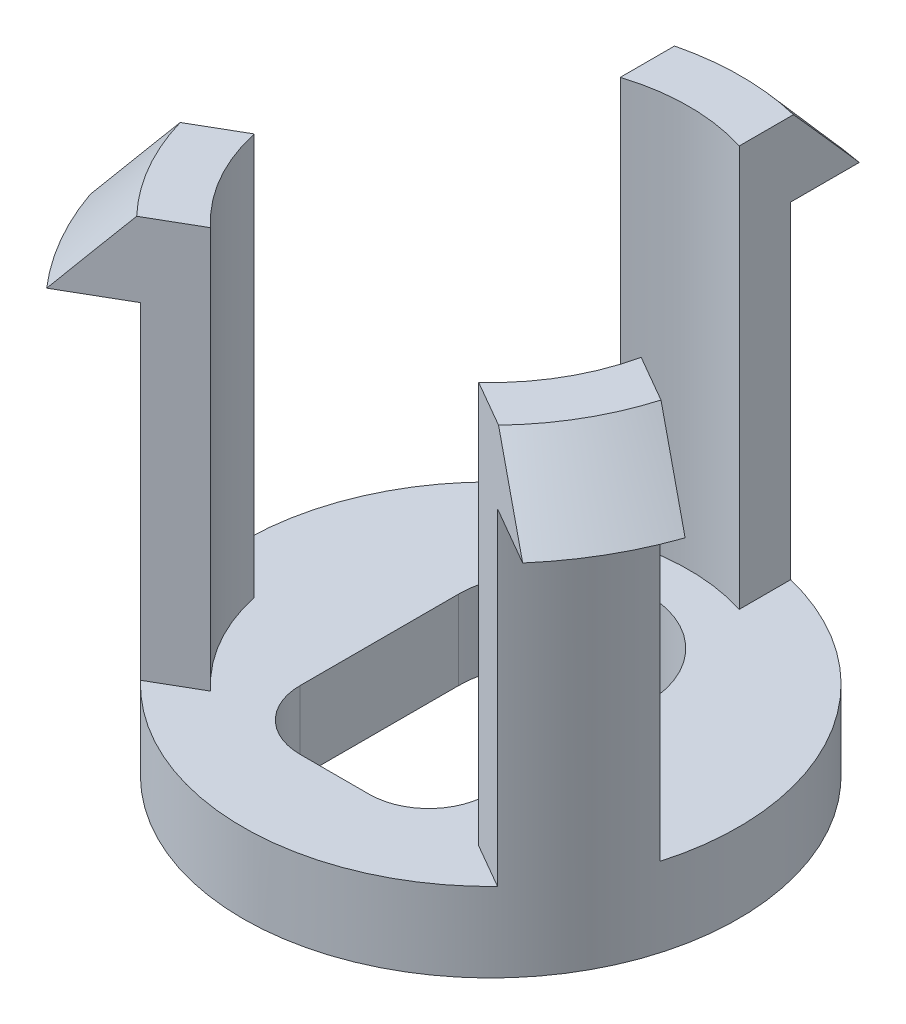
ISO-10303-21;
HEADER;
FILE_DESCRIPTION(('STEP AP214'),'2;1');
FILE_NAME('part.step','',(''),(''),'','','');
FILE_SCHEMA(('AUTOMOTIVE_DESIGN { 1 0 10303 214 1 1 1 1 }'));
ENDSEC;
DATA;
#1=APPLICATION_CONTEXT('core data for automotive mechanical design processes');
#2=APPLICATION_PROTOCOL_DEFINITION('international standard','automotive_design',2000,#1);
#3=PRODUCT_CONTEXT('',#1,'mechanical');
#4=PRODUCT('Part','Part','',(#3));
#5=PRODUCT_RELATED_PRODUCT_CATEGORY('part','',(#4));
#6=PRODUCT_DEFINITION_FORMATION('','',#4);
#7=PRODUCT_DEFINITION_CONTEXT('part definition',#1,'design');
#8=PRODUCT_DEFINITION('design','',#6,#7);
#9=PRODUCT_DEFINITION_SHAPE('','',#8);
#10=(LENGTH_UNIT() NAMED_UNIT(*) SI_UNIT(.MILLI.,.METRE.));
#11=(NAMED_UNIT(*) PLANE_ANGLE_UNIT() SI_UNIT($,.RADIAN.));
#12=(NAMED_UNIT(*) SI_UNIT($,.STERADIAN.) SOLID_ANGLE_UNIT());
#13=UNCERTAINTY_MEASURE_WITH_UNIT(LENGTH_MEASURE(1.E-05),#10,'distance_accuracy_value','');
#14=(GEOMETRIC_REPRESENTATION_CONTEXT(3) GLOBAL_UNCERTAINTY_ASSIGNED_CONTEXT((#13)) GLOBAL_UNIT_ASSIGNED_CONTEXT((#10,
#11,#12)) REPRESENTATION_CONTEXT('',''));
#15=CARTESIAN_POINT('',(0.,0.,0.));
#16=DIRECTION('',(0.,0.,1.));
#17=DIRECTION('',(1.,0.,0.));
#18=AXIS2_PLACEMENT_3D('',#15,#16,#17);
#19=CARTESIAN_POINT('',(0.,9.7,0.));
#20=DIRECTION('',(0.,1.,0.));
#21=DIRECTION('',(0.,0.,1.));
#22=AXIS2_PLACEMENT_3D('',#19,#20,#21);
#23=PLANE('',#22);
#24=DIRECTION('',(0.,0.,-1.));
#25=VECTOR('',#24,1.);
#26=CARTESIAN_POINT('',(1.2,9.7,-4.85386443980464));
#27=LINE('',#26,#25);
#28=CARTESIAN_POINT('',(1.2,9.7,-3.81575680566778));
#29=VERTEX_POINT('',#28);
#30=CARTESIAN_POINT('',(1.2,9.7,-4.90933251836967));
#31=VERTEX_POINT('',#30);
#32=EDGE_CURVE('E395',#29,#31,#27,.T.);
#33=ORIENTED_EDGE('',*,*,#32,.T.);
#34=CARTESIAN_POINT('',(0.,9.7,0.));
#35=DIRECTION('',(0.,-1.,0.));
#36=DIRECTION('',(0.,0.,-1.));
#37=AXIS2_PLACEMENT_3D('',#34,#35,#36);
#38=CIRCLE('',#37,5.05386443980464);
#39=CARTESIAN_POINT('',(-1.2,9.7,-4.90933251836967));
#40=VERTEX_POINT('',#39);
#41=EDGE_CURVE('E320',#40,#31,#38,.T.);
#42=ORIENTED_EDGE('',*,*,#41,.F.);
#43=DIRECTION('',(0.,0.,1.));
#44=VECTOR('',#43,1.);
#45=CARTESIAN_POINT('',(-1.2,9.7,-4.85386443980464));
#46=LINE('',#45,#44);
#47=CARTESIAN_POINT('',(-1.2,9.7,-3.81575680566778));
#48=VERTEX_POINT('',#47);
#49=EDGE_CURVE('E390',#40,#48,#46,.T.);
#50=ORIENTED_EDGE('',*,*,#49,.T.);
#51=CARTESIAN_POINT('',(0.,9.7,0.));
#52=DIRECTION('',(0.,-1.,0.));
#53=DIRECTION('',(0.,0.,1.));
#54=AXIS2_PLACEMENT_3D('',#51,#52,#53);
#55=CIRCLE('',#54,4.);
#56=EDGE_CURVE('E392',#48,#29,#55,.T.);
#57=ORIENTED_EDGE('',*,*,#56,.T.);
#58=EDGE_LOOP('',(#33,#42,#50,#57));
#59=FACE_BOUND('',#58,.T.);
#60=ADVANCED_FACE('F30',(#59),#23,.T.);
#61=CARTESIAN_POINT('',(0.,8.2,-6.35386443980464));
#62=DIRECTION('',(0.,-1.,0.));
#63=DIRECTION('',(0.,0.,-1.));
#64=AXIS2_PLACEMENT_3D('',#61,#62,#63);
#65=PLANE('',#64);
#66=DIRECTION('',(0.,0.,-1.));
#67=VECTOR('',#66,1.);
#68=CARTESIAN_POINT('',(1.2,8.2,-6.2395186769024));
#69=LINE('',#68,#67);
#70=CARTESIAN_POINT('',(1.2,8.2,-4.85386443980464));
#71=VERTEX_POINT('',#70);
#72=CARTESIAN_POINT('',(1.2,8.2,-6.2395186769024));
#73=VERTEX_POINT('',#72);
#74=EDGE_CURVE('E227',#71,#73,#69,.T.);
#75=ORIENTED_EDGE('',*,*,#74,.F.);
#76=CARTESIAN_POINT('',(0.,8.2,0.));
#77=DIRECTION('',(0.,-1.,0.));
#78=DIRECTION('',(0.,0.,-1.));
#79=AXIS2_PLACEMENT_3D('',#76,#77,#78);
#80=CIRCLE('',#79,5.);
#81=CARTESIAN_POINT('',(-1.2,8.2,-4.85386443980464));
#82=VERTEX_POINT('',#81);
#83=EDGE_CURVE('E341',#82,#71,#80,.T.);
#84=ORIENTED_EDGE('',*,*,#83,.F.);
#85=DIRECTION('',(0.,0.,1.));
#86=VECTOR('',#85,1.);
#87=CARTESIAN_POINT('',(-1.2,8.2,-4.85386443980464));
#88=LINE('',#87,#86);
#89=CARTESIAN_POINT('',(-1.2,8.2,-6.2395186769024));
#90=VERTEX_POINT('',#89);
#91=EDGE_CURVE('E464',#90,#82,#88,.T.);
#92=ORIENTED_EDGE('',*,*,#91,.F.);
#93=CARTESIAN_POINT('',(0.,8.2,0.));
#94=DIRECTION('',(0.,-1.,0.));
#95=DIRECTION('',(0.,0.,-1.));
#96=AXIS2_PLACEMENT_3D('',#93,#94,#95);
#97=CIRCLE('',#96,6.35386443980464);
#98=EDGE_CURVE('E333',#90,#73,#97,.T.);
#99=ORIENTED_EDGE('',*,*,#98,.T.);
#100=EDGE_LOOP('',(#75,#84,#92,#99));
#101=FACE_BOUND('',#100,.T.);
#102=ADVANCED_FACE('F293',(#101),#65,.T.);
#103=CARTESIAN_POINT('',(0.,8.2,0.));
#104=DIRECTION('',(0.,-1.,0.));
#105=DIRECTION('',(0.,0.,-1.));
#106=AXIS2_PLACEMENT_3D('',#103,#104,#105);
#107=CONICAL_SURFACE('',#106,6.35386443980464,0.714090698612158);
#108=CARTESIAN_POINT('',(1.2,5.58286886134033,-8.53812952835899));
#109=CARTESIAN_POINT('',(1.2,5.81730456258432,-8.33295397783278));
#110=CARTESIAN_POINT('',(1.2,6.05167091913458,-8.12769928122429));
#111=CARTESIAN_POINT('',(1.2,6.52022532734995,-7.71698587480679));
#112=CARTESIAN_POINT('',(1.2,6.75441337878423,-7.51152716473445));
#113=CARTESIAN_POINT('',(1.2,7.45663956588861,-6.89478616674094));
#114=CARTESIAN_POINT('',(1.2,7.92434993069708,-6.48313009431151));
#115=CARTESIAN_POINT('',(1.2,8.62477351205438,-5.8643411975775));
#116=CARTESIAN_POINT('',(1.2,8.85806062443457,-5.65785817460679));
#117=CARTESIAN_POINT('',(1.2,9.32409883499572,-5.24428960419535));
#118=CARTESIAN_POINT('',(1.2,9.55684993517134,-5.0372040590033));
#119=CARTESIAN_POINT('',(1.2,10.0215991079049,-4.62217806334628));
#120=CARTESIAN_POINT('',(1.2,10.2535971634296,-4.41423759378138));
#121=CARTESIAN_POINT('',(1.2,10.6007380196826,-4.10137358004929));
#122=CARTESIAN_POINT('',(1.2,10.7163096492232,-3.99692603876367));
#123=CARTESIAN_POINT('',(1.2,10.9470865383504,-3.78762612077505));
#124=CARTESIAN_POINT('',(1.2,11.0622917963956,-3.68277374237276));
#125=CARTESIAN_POINT('',(1.2,11.1772731452379,-3.57767563893612));
#126=B_SPLINE_CURVE_WITH_KNOTS('',3,(#108,#109,#110,#111,#112,#113,#114,#115,#116,#117,#118,
#119,#120,#121,#122,#123,#124,#125),.UNSPECIFIED.,.F.,.F.,(4,2,2,2,2,2,2,2,4),(0.,
0.934619516385951,1.86924024070846,3.73844105368542,4.67306485780881,5.60768517827459,
6.54232649386947,7.00965295795956,7.47698138579348),.UNSPECIFIED.);
#127=EDGE_CURVE('E236',#73,#31,#126,.T.);
#128=ORIENTED_EDGE('',*,*,#127,.F.);
#129=ORIENTED_EDGE('',*,*,#98,.F.);
#130=CARTESIAN_POINT('',(-1.2,11.1772731452379,-3.57767563893612));
#131=CARTESIAN_POINT('',(-1.2,11.0622917963956,-3.68277374237276));
#132=CARTESIAN_POINT('',(-1.2,10.9470865383504,-3.78762612077506));
#133=CARTESIAN_POINT('',(-1.2,10.7163096492232,-3.99692603876367));
#134=CARTESIAN_POINT('',(-1.2,10.6007380196826,-4.10137358004929));
#135=CARTESIAN_POINT('',(-1.2,10.2535971634296,-4.41423759378138));
#136=CARTESIAN_POINT('',(-1.2,10.0215991079049,-4.62217806334628));
#137=CARTESIAN_POINT('',(-1.2,9.55684993517134,-5.0372040590033));
#138=CARTESIAN_POINT('',(-1.2,9.32409883499572,-5.24428960419535));
#139=CARTESIAN_POINT('',(-1.2,8.85806062443457,-5.65785817460679));
#140=CARTESIAN_POINT('',(-1.2,8.62477351205438,-5.8643411975775));
#141=CARTESIAN_POINT('',(-1.2,7.92434993069708,-6.48313009431151));
#142=CARTESIAN_POINT('',(-1.2,7.45663956588861,-6.89478616674094));
#143=CARTESIAN_POINT('',(-1.2,6.75441337878423,-7.51152716473445));
#144=CARTESIAN_POINT('',(-1.2,6.52022532734996,-7.71698587480679));
#145=CARTESIAN_POINT('',(-1.2,6.05167091913458,-8.12769928122429));
#146=CARTESIAN_POINT('',(-1.2,5.81730456258432,-8.33295397783278));
#147=CARTESIAN_POINT('',(-1.2,5.58286886134034,-8.53812952835898));
#148=B_SPLINE_CURVE_WITH_KNOTS('',3,(#130,#131,#132,#133,#134,#135,#136,#137,#138,#139,#140,
#141,#142,#143,#144,#145,#146,#147),.UNSPECIFIED.,.F.,.F.,(4,2,2,2,2,2,2,2,4),(0.,
0.467328427833928,0.934654891924016,1.86929620751889,2.80391652798467,3.73854033210806,
5.60774114508503,6.54236186940753,7.47698138579348),.UNSPECIFIED.);
#149=EDGE_CURVE('E474',#40,#90,#148,.T.);
#150=ORIENTED_EDGE('',*,*,#149,.F.);
#151=ORIENTED_EDGE('',*,*,#41,.T.);
#152=EDGE_LOOP('',(#128,#129,#150,#151));
#153=FACE_BOUND('',#152,.T.);
#154=ADVANCED_FACE('F298',(#153),#107,.T.);
#155=CARTESIAN_POINT('',(4.85160667653316,9.7,1.41543577464353));
#156=VERTEX_POINT('',#155);
#157=CARTESIAN_POINT('',(3.65160667653315,9.7,3.49389674372618));
#158=VERTEX_POINT('',#157);
#159=EDGE_CURVE('E311',#156,#158,#38,.T.);
#160=ORIENTED_EDGE('',*,*,#159,.F.);
#161=DIRECTION('',(-0.866025403784437,0.,-0.500000000000004));
#162=VECTOR('',#161,1.);
#163=CARTESIAN_POINT('',(4.80356991139674,9.7,1.38770173536102));
#164=LINE('',#163,#162);
#165=CARTESIAN_POINT('',(3.90454232837166,9.7,0.868647918292585));
#166=VERTEX_POINT('',#165);
#167=EDGE_CURVE('E312',#156,#166,#164,.T.);
#168=ORIENTED_EDGE('',*,*,#167,.T.);
#169=CARTESIAN_POINT('',(0.,9.7,0.));
#170=DIRECTION('',(0.,-1.,0.));
#171=DIRECTION('',(-0.866025403784436,0.,-0.500000000000004));
#172=AXIS2_PLACEMENT_3D('',#169,#170,#171);
#173=CIRCLE('',#172,4.);
#174=CARTESIAN_POINT('',(2.70454232837165,9.7,2.94710888737523));
#175=VERTEX_POINT('',#174);
#176=EDGE_CURVE('E370',#166,#175,#173,.T.);
#177=ORIENTED_EDGE('',*,*,#176,.T.);
#178=DIRECTION('',(0.866025403784437,0.,0.500000000000004));
#179=VECTOR('',#178,1.);
#180=CARTESIAN_POINT('',(3.60356991139673,9.7,3.46616270444366));
#181=LINE('',#180,#179);
#182=EDGE_CURVE('E315',#175,#158,#181,.T.);
#183=ORIENTED_EDGE('',*,*,#182,.T.);
#184=EDGE_LOOP('',(#160,#168,#177,#183));
#185=FACE_BOUND('',#184,.T.);
#186=ADVANCED_FACE('F261',(#185),#23,.T.);
#187=DIRECTION('',(-0.866025403784437,0.,-0.500000000000002));
#188=VECTOR('',#187,1.);
#189=CARTESIAN_POINT('',(4.80356991139674,8.2,1.38770173536102));
#190=LINE('',#189,#188);
#191=CARTESIAN_POINT('',(6.00358168158494,8.2,2.0805288539099));
#192=VERTEX_POINT('',#191);
#193=CARTESIAN_POINT('',(4.80356991139674,8.2,1.38770173536102));
#194=VERTEX_POINT('',#193);
#195=EDGE_CURVE('E224',#192,#194,#190,.T.);
#196=ORIENTED_EDGE('',*,*,#195,.F.);
#197=CARTESIAN_POINT('',(4.80358168158493,8.2,4.15898982299255));
#198=VERTEX_POINT('',#197);
#199=EDGE_CURVE('E337',#192,#198,#97,.T.);
#200=ORIENTED_EDGE('',*,*,#199,.T.);
#201=DIRECTION('',(0.866025403784436,0.,0.500000000000004));
#202=VECTOR('',#201,1.);
#203=CARTESIAN_POINT('',(4.80358168158493,8.2,4.15898982299255));
#204=LINE('',#203,#202);
#205=CARTESIAN_POINT('',(3.60356991139673,8.2,3.46616270444366));
#206=VERTEX_POINT('',#205);
#207=EDGE_CURVE('E535',#206,#198,#204,.T.);
#208=ORIENTED_EDGE('',*,*,#207,.F.);
#209=EDGE_CURVE('E340',#194,#206,#80,.T.);
#210=ORIENTED_EDGE('',*,*,#209,.F.);
#211=EDGE_LOOP('',(#196,#200,#208,#210));
#212=FACE_BOUND('',#211,.T.);
#213=ADVANCED_FACE('F300',(#212),#65,.T.);
#214=CARTESIAN_POINT('',(4.8514521459991,9.7002,1.41534655639809));
#215=CARTESIAN_POINT('',(4.9478001074423,9.57549928343645,1.4709730778732));
#216=CARTESIAN_POINT('',(5.04404801685495,9.45069560449613,1.52654183428153));
#217=CARTESIAN_POINT('',(5.23637311640144,9.20091336298655,1.63758078227662));
#218=CARTESIAN_POINT('',(5.33245030683866,9.07593480072876,1.69305097403853));
#219=CARTESIAN_POINT('',(5.52446364224954,8.82583345957066,1.803909924926));
#220=CARTESIAN_POINT('',(5.6203997873018,8.70071068075078,1.85929868409694));
#221=CARTESIAN_POINT('',(5.81215204008776,8.45034214061854,1.97000689886063));
#222=CARTESIAN_POINT('',(5.90796814760827,8.32509637908849,2.0253263543303));
#223=CARTESIAN_POINT('',(6.00373454352155,8.1998,2.08061710879015));
#224=B_SPLINE_CURVE_WITH_KNOTS('',3,(#214,#215,#216,#217,#218,#219,#220,#221,#222,#223),
.UNSPECIFIED.,.F.,.F.,(4,2,2,2,4),(0.,0.501345575027477,1.00269025829784,1.50403466213868,
2.00537995507539),.UNSPECIFIED.);
#225=EDGE_CURVE('E229',#156,#192,#224,.T.);
#226=ORIENTED_EDGE('',*,*,#225,.F.);
#227=ORIENTED_EDGE('',*,*,#159,.T.);
#228=CARTESIAN_POINT('',(4.80373454352154,8.1998,4.1590780778728));
#229=CARTESIAN_POINT('',(4.70796814760826,8.32509637908849,4.10378732341295));
#230=CARTESIAN_POINT('',(4.61215204008775,8.45034214061855,4.04846786794327));
#231=CARTESIAN_POINT('',(4.42039978730179,8.70071068075078,3.93775965317959));
#232=CARTESIAN_POINT('',(4.32446364224953,8.82583345957066,3.88237089400865));
#233=CARTESIAN_POINT('',(4.13245030683865,9.07593480072876,3.77151194312117));
#234=CARTESIAN_POINT('',(4.03637311640144,9.20091336298655,3.71604175135927));
#235=CARTESIAN_POINT('',(3.84404801685494,9.45069560449613,3.60500280336417));
#236=CARTESIAN_POINT('',(3.74780010744229,9.57549928343645,3.54943404695584));
#237=CARTESIAN_POINT('',(3.65145214599909,9.7002,3.49380752548074));
#238=B_SPLINE_CURVE_WITH_KNOTS('',3,(#228,#229,#230,#231,#232,#233,#234,#235,#236,#237),
.UNSPECIFIED.,.F.,.F.,(4,2,2,2,4),(0.,0.501345292936719,1.00268969677755,1.50403438004792,
2.00537995507539),.UNSPECIFIED.);
#239=EDGE_CURVE('E458',#198,#158,#238,.T.);
#240=ORIENTED_EDGE('',*,*,#239,.F.);
#241=ORIENTED_EDGE('',*,*,#199,.F.);
#242=EDGE_LOOP('',(#226,#227,#240,#241));
#243=FACE_BOUND('',#242,.T.);
#244=ADVANCED_FACE('F259',(#243),#107,.T.);
#245=CARTESIAN_POINT('',(-3.6516066765332,9.7,3.49389674372613));
#246=VERTEX_POINT('',#245);
#247=CARTESIAN_POINT('',(-4.85160667653318,9.7,1.41543577464346));
#248=VERTEX_POINT('',#247);
#249=EDGE_CURVE('E321',#246,#248,#38,.T.);
#250=ORIENTED_EDGE('',*,*,#249,.F.);
#251=DIRECTION('',(0.866025403784443,0.,-0.499999999999992));
#252=VECTOR('',#251,1.);
#253=CARTESIAN_POINT('',(-3.60356991139677,9.7,3.46616270444361));
#254=LINE('',#253,#252);
#255=CARTESIAN_POINT('',(-2.70454232837169,9.7,2.94710888737519));
#256=VERTEX_POINT('',#255);
#257=EDGE_CURVE('E342',#246,#256,#254,.T.);
#258=ORIENTED_EDGE('',*,*,#257,.T.);
#259=CARTESIAN_POINT('',(0.,9.7,0.));
#260=DIRECTION('',(0.,-1.,0.));
#261=DIRECTION('',(0.866025403784443,0.,-0.499999999999992));
#262=AXIS2_PLACEMENT_3D('',#259,#260,#261);
#263=CIRCLE('',#262,4.);
#264=CARTESIAN_POINT('',(-3.90454232837167,9.7,0.868647918292529));
#265=VERTEX_POINT('',#264);
#266=EDGE_CURVE('E344',#256,#265,#263,.T.);
#267=ORIENTED_EDGE('',*,*,#266,.T.);
#268=DIRECTION('',(-0.866025403784443,0.,0.499999999999992));
#269=VECTOR('',#268,1.);
#270=CARTESIAN_POINT('',(-4.80356991139675,9.7,1.38770173536095));
#271=LINE('',#270,#269);
#272=EDGE_CURVE('E347',#265,#248,#271,.T.);
#273=ORIENTED_EDGE('',*,*,#272,.T.);
#274=EDGE_LOOP('',(#250,#258,#267,#273));
#275=FACE_BOUND('',#274,.T.);
#276=ADVANCED_FACE('F255',(#275),#23,.T.);
#277=DIRECTION('',(0.866025403784443,0.,-0.499999999999992));
#278=VECTOR('',#277,1.);
#279=CARTESIAN_POINT('',(-3.60356991139677,8.2,3.46616270444361));
#280=LINE('',#279,#278);
#281=CARTESIAN_POINT('',(-4.80358168158499,8.2,4.15898982299248));
#282=VERTEX_POINT('',#281);
#283=CARTESIAN_POINT('',(-3.60356991139677,8.2,3.46616270444361));
#284=VERTEX_POINT('',#283);
#285=EDGE_CURVE('E537',#282,#284,#280,.T.);
#286=ORIENTED_EDGE('',*,*,#285,.F.);
#287=CARTESIAN_POINT('',(-6.00358168158497,8.2,2.08052885390982));
#288=VERTEX_POINT('',#287);
#289=EDGE_CURVE('E324',#282,#288,#97,.T.);
#290=ORIENTED_EDGE('',*,*,#289,.T.);
#291=DIRECTION('',(-0.866025403784443,0.,0.499999999999993));
#292=VECTOR('',#291,1.);
#293=CARTESIAN_POINT('',(-6.00358168158497,8.2,2.08052885390982));
#294=LINE('',#293,#292);
#295=CARTESIAN_POINT('',(-4.80356991139675,8.2,1.38770173536095));
#296=VERTEX_POINT('',#295);
#297=EDGE_CURVE('E472',#296,#288,#294,.T.);
#298=ORIENTED_EDGE('',*,*,#297,.F.);
#299=EDGE_CURVE('E336',#284,#296,#80,.T.);
#300=ORIENTED_EDGE('',*,*,#299,.F.);
#301=EDGE_LOOP('',(#286,#290,#298,#300));
#302=FACE_BOUND('',#301,.T.);
#303=ADVANCED_FACE('F258',(#302),#65,.T.);
#304=CARTESIAN_POINT('',(0.,1.6,0.));
#305=DIRECTION('',(0.,1.,0.));
#306=DIRECTION('',(0.,0.,1.));
#307=AXIS2_PLACEMENT_3D('',#304,#305,#306);
#308=PLANE('',#307);
#309=CARTESIAN_POINT('',(0.,1.6,-1.25));
#310=DIRECTION('',(0.,1.,0.));
#311=DIRECTION('',(0.,0.,-1.));
#312=AXIS2_PLACEMENT_3D('',#309,#310,#311);
#313=CIRCLE('',#312,1.9);
#314=CARTESIAN_POINT('',(1.9,1.6,-1.25));
#315=VERTEX_POINT('',#314);
#316=CARTESIAN_POINT('',(-1.9,1.6,-1.25));
#317=VERTEX_POINT('',#316);
#318=EDGE_CURVE('E197',#315,#317,#313,.T.);
#319=ORIENTED_EDGE('',*,*,#318,.F.);
#320=DIRECTION('',(0.,0.,-1.));
#321=VECTOR('',#320,1.);
#322=CARTESIAN_POINT('',(1.9,1.6,3.15));
#323=LINE('',#322,#321);
#324=CARTESIAN_POINT('',(1.9,1.6,1.95));
#325=VERTEX_POINT('',#324);
#326=EDGE_CURVE('E212',#325,#315,#323,.T.);
#327=ORIENTED_EDGE('',*,*,#326,.F.);
#328=CARTESIAN_POINT('',(0.699999999999999,1.6,1.95));
#329=DIRECTION('',(0.,1.,0.));
#330=DIRECTION('',(0.,0.,1.));
#331=AXIS2_PLACEMENT_3D('',#328,#329,#330);
#332=CIRCLE('',#331,1.2);
#333=CARTESIAN_POINT('',(0.699999999999999,1.6,3.15));
#334=VERTEX_POINT('',#333);
#335=EDGE_CURVE('E433',#325,#334,#332,.F.);
#336=ORIENTED_EDGE('',*,*,#335,.T.);
#337=DIRECTION('',(1.,0.,0.));
#338=VECTOR('',#337,1.);
#339=CARTESIAN_POINT('',(-1.9,1.6,3.15));
#340=LINE('',#339,#338);
#341=CARTESIAN_POINT('',(-0.700000000000001,1.6,3.15));
#342=VERTEX_POINT('',#341);
#343=EDGE_CURVE('E214',#342,#334,#340,.T.);
#344=ORIENTED_EDGE('',*,*,#343,.F.);
#345=CARTESIAN_POINT('',(-0.700000000000001,1.6,1.95));
#346=DIRECTION('',(0.,1.,0.));
#347=DIRECTION('',(0.,0.,1.));
#348=AXIS2_PLACEMENT_3D('',#345,#346,#347);
#349=CIRCLE('',#348,1.2);
#350=CARTESIAN_POINT('',(-1.9,1.6,1.95));
#351=VERTEX_POINT('',#350);
#352=EDGE_CURVE('E38',#342,#351,#349,.F.);
#353=ORIENTED_EDGE('',*,*,#352,.T.);
#354=DIRECTION('',(0.,0.,1.));
#355=VECTOR('',#354,1.);
#356=CARTESIAN_POINT('',(-1.9,1.6,3.15));
#357=LINE('',#356,#355);
#358=EDGE_CURVE('E220',#317,#351,#357,.T.);
#359=ORIENTED_EDGE('',*,*,#358,.F.);
#360=EDGE_LOOP('',(#319,#327,#336,#344,#353,#359));
#361=FACE_BOUND('',#360,.T.);
#362=CARTESIAN_POINT('',(0.,1.6,0.));
#363=DIRECTION('',(0.,-1.,0.));
#364=DIRECTION('',(0.866025403784443,0.,-0.499999999999992));
#365=AXIS2_PLACEMENT_3D('',#362,#363,#364);
#366=CIRCLE('',#365,4.);
#367=CARTESIAN_POINT('',(-2.70454232837169,1.6,2.94710888737519));
#368=VERTEX_POINT('',#367);
#369=CARTESIAN_POINT('',(-3.90454232837167,1.6,0.86864791829253));
#370=VERTEX_POINT('',#369);
#371=EDGE_CURVE('E354',#368,#370,#366,.T.);
#372=ORIENTED_EDGE('',*,*,#371,.F.);
#373=DIRECTION('',(0.866025403784443,0.,-0.499999999999992));
#374=VECTOR('',#373,1.);
#375=CARTESIAN_POINT('',(-3.60356991139677,1.6,3.46616270444361));
#376=LINE('',#375,#374);
#377=CARTESIAN_POINT('',(-3.60356991139677,1.6,3.46616270444361));
#378=VERTEX_POINT('',#377);
#379=EDGE_CURVE('E351',#378,#368,#376,.T.);
#380=ORIENTED_EDGE('',*,*,#379,.F.);
#381=CARTESIAN_POINT('',(0.,1.6,0.));
#382=DIRECTION('',(0.,1.,0.));
#383=DIRECTION('',(0.,0.,1.));
#384=AXIS2_PLACEMENT_3D('',#381,#382,#383);
#385=CIRCLE('',#384,5.);
#386=CARTESIAN_POINT('',(3.60356991139673,1.6,3.46616270444366));
#387=VERTEX_POINT('',#386);
#388=EDGE_CURVE('E418',#378,#387,#385,.T.);
#389=ORIENTED_EDGE('',*,*,#388,.T.);
#390=DIRECTION('',(0.866025403784437,0.,0.500000000000004));
#391=VECTOR('',#390,1.);
#392=CARTESIAN_POINT('',(3.60356991139673,1.6,3.46616270444366));
#393=LINE('',#392,#391);
#394=CARTESIAN_POINT('',(2.70454232837165,1.6,2.94710888737523));
#395=VERTEX_POINT('',#394);
#396=EDGE_CURVE('E371',#395,#387,#393,.T.);
#397=ORIENTED_EDGE('',*,*,#396,.F.);
#398=CARTESIAN_POINT('',(0.,1.6,0.));
#399=DIRECTION('',(0.,-1.,0.));
#400=DIRECTION('',(-0.866025403784436,0.,-0.500000000000004));
#401=AXIS2_PLACEMENT_3D('',#398,#399,#400);
#402=CIRCLE('',#401,4.);
#403=CARTESIAN_POINT('',(3.90454232837166,1.6,0.868647918292585));
#404=VERTEX_POINT('',#403);
#405=EDGE_CURVE('E376',#404,#395,#402,.T.);
#406=ORIENTED_EDGE('',*,*,#405,.F.);
#407=DIRECTION('',(-0.866025403784437,0.,-0.500000000000004));
#408=VECTOR('',#407,1.);
#409=CARTESIAN_POINT('',(4.80356991139674,1.6,1.38770173536102));
#410=LINE('',#409,#408);
#411=CARTESIAN_POINT('',(4.80356991139674,1.6,1.38770173536102));
#412=VERTEX_POINT('',#411);
#413=EDGE_CURVE('E368',#412,#404,#410,.T.);
#414=ORIENTED_EDGE('',*,*,#413,.F.);
#415=CARTESIAN_POINT('',(1.2,1.6,-4.85386443980464));
#416=VERTEX_POINT('',#415);
#417=EDGE_CURVE('E413',#412,#416,#385,.T.);
#418=ORIENTED_EDGE('',*,*,#417,.T.);
#419=DIRECTION('',(0.,0.,-1.));
#420=VECTOR('',#419,1.);
#421=CARTESIAN_POINT('',(1.2,1.6,-4.85386443980464));
#422=LINE('',#421,#420);
#423=CARTESIAN_POINT('',(1.2,1.6,-3.81575680566778));
#424=VERTEX_POINT('',#423);
#425=EDGE_CURVE('E393',#424,#416,#422,.T.);
#426=ORIENTED_EDGE('',*,*,#425,.F.);
#427=CARTESIAN_POINT('',(0.,1.6,0.));
#428=DIRECTION('',(0.,-1.,0.));
#429=DIRECTION('',(0.,0.,1.));
#430=AXIS2_PLACEMENT_3D('',#427,#428,#429);
#431=CIRCLE('',#430,4.);
#432=CARTESIAN_POINT('',(-1.2,1.6,-3.81575680566778));
#433=VERTEX_POINT('',#432);
#434=EDGE_CURVE('E398',#433,#424,#431,.T.);
#435=ORIENTED_EDGE('',*,*,#434,.F.);
#436=DIRECTION('',(0.,0.,1.));
#437=VECTOR('',#436,1.);
#438=CARTESIAN_POINT('',(-1.2,1.6,-4.85386443980464));
#439=LINE('',#438,#437);
#440=CARTESIAN_POINT('',(-1.2,1.6,-4.85386443980464));
#441=VERTEX_POINT('',#440);
#442=EDGE_CURVE('E389',#441,#433,#439,.T.);
#443=ORIENTED_EDGE('',*,*,#442,.F.);
#444=CARTESIAN_POINT('',(-4.80356991139675,1.6,1.38770173536095));
#445=VERTEX_POINT('',#444);
#446=EDGE_CURVE('E427',#441,#445,#385,.T.);
#447=ORIENTED_EDGE('',*,*,#446,.T.);
#448=DIRECTION('',(-0.866025403784443,0.,0.499999999999992));
#449=VECTOR('',#448,1.);
#450=CARTESIAN_POINT('',(-4.80356991139675,1.6,1.38770173536095));
#451=LINE('',#450,#449);
#452=EDGE_CURVE('E345',#370,#445,#451,.T.);
#453=ORIENTED_EDGE('',*,*,#452,.F.);
#454=EDGE_LOOP('',(#372,#380,#389,#397,#406,#414,#418,#426,#435,#443,#447,#453));
#455=FACE_BOUND('',#454,.T.);
#456=ADVANCED_FACE('F273',(#361,#455),#308,.T.);
#457=CARTESIAN_POINT('',(0.,1.6,0.));
#458=DIRECTION('',(0.,-1.,0.));
#459=DIRECTION('',(0.,0.,-1.));
#460=AXIS2_PLACEMENT_3D('',#457,#458,#459);
#461=CYLINDRICAL_SURFACE('',#460,5.);
#462=DIRECTION('',(0.,-1.,0.));
#463=VECTOR('',#462,1.);
#464=CARTESIAN_POINT('',(4.80356991139674,9.7,1.38770173536102));
#465=LINE('',#464,#463);
#466=EDGE_CURVE('E387',#194,#412,#465,.T.);
#467=ORIENTED_EDGE('',*,*,#466,.F.);
#468=ORIENTED_EDGE('',*,*,#209,.T.);
#469=DIRECTION('',(0.,-1.,0.));
#470=VECTOR('',#469,1.);
#471=CARTESIAN_POINT('',(3.60356991139673,9.7,3.46616270444366));
#472=LINE('',#471,#470);
#473=EDGE_CURVE('E374',#206,#387,#472,.T.);
#474=ORIENTED_EDGE('',*,*,#473,.T.);
#475=ORIENTED_EDGE('',*,*,#388,.F.);
#476=DIRECTION('',(0.,-1.,0.));
#477=VECTOR('',#476,1.);
#478=CARTESIAN_POINT('',(-3.60356991139677,9.7,3.46616270444361));
#479=LINE('',#478,#477);
#480=EDGE_CURVE('E366',#284,#378,#479,.T.);
#481=ORIENTED_EDGE('',*,*,#480,.F.);
#482=ORIENTED_EDGE('',*,*,#299,.T.);
#483=DIRECTION('',(0.,-1.,0.));
#484=VECTOR('',#483,1.);
#485=CARTESIAN_POINT('',(-4.80356991139675,9.7,1.38770173536095));
#486=LINE('',#485,#484);
#487=EDGE_CURVE('E350',#296,#445,#486,.T.);
#488=ORIENTED_EDGE('',*,*,#487,.T.);
#489=ORIENTED_EDGE('',*,*,#446,.F.);
#490=DIRECTION('',(0.,-1.,0.));
#491=VECTOR('',#490,1.);
#492=CARTESIAN_POINT('',(-1.2,9.7,-4.85386443980464));
#493=LINE('',#492,#491);
#494=EDGE_CURVE('E419',#82,#441,#493,.T.);
#495=ORIENTED_EDGE('',*,*,#494,.F.);
#496=ORIENTED_EDGE('',*,*,#83,.T.);
#497=DIRECTION('',(0.,-1.,0.));
#498=VECTOR('',#497,1.);
#499=CARTESIAN_POINT('',(1.2,9.7,-4.85386443980464));
#500=LINE('',#499,#498);
#501=EDGE_CURVE('E397',#71,#416,#500,.T.);
#502=ORIENTED_EDGE('',*,*,#501,.T.);
#503=ORIENTED_EDGE('',*,*,#417,.F.);
#504=EDGE_LOOP('',(#467,#468,#474,#475,#481,#482,#488,#489,#495,#496,#502,#503));
#505=FACE_BOUND('',#504,.T.);
#506=CARTESIAN_POINT('',(0.,0.,0.));
#507=DIRECTION('',(0.,1.,0.));
#508=DIRECTION('',(0.,0.,1.));
#509=AXIS2_PLACEMENT_3D('',#506,#507,#508);
#510=CIRCLE('',#509,5.);
#511=CARTESIAN_POINT('',(0.,0.,5.));
#512=VERTEX_POINT('',#511);
#513=EDGE_CURVE('E421',#512,#512,#510,.T.);
#514=ORIENTED_EDGE('',*,*,#513,.T.);
#515=EDGE_LOOP('',(#514));
#516=FACE_BOUND('',#515,.T.);
#517=ADVANCED_FACE('F276',(#505,#516),#461,.T.);
#518=CARTESIAN_POINT('',(0.,0.,0.));
#519=DIRECTION('',(0.,1.,0.));
#520=DIRECTION('',(0.,0.,1.));
#521=AXIS2_PLACEMENT_3D('',#518,#519,#520);
#522=PLANE('',#521);
#523=DIRECTION('',(1.,0.,0.));
#524=VECTOR('',#523,1.);
#525=CARTESIAN_POINT('',(-1.9,0.,3.15));
#526=LINE('',#525,#524);
#527=CARTESIAN_POINT('',(-0.700000000000001,0.,3.15));
#528=VERTEX_POINT('',#527);
#529=CARTESIAN_POINT('',(0.699999999999999,0.,3.15));
#530=VERTEX_POINT('',#529);
#531=EDGE_CURVE('E205',#528,#530,#526,.T.);
#532=ORIENTED_EDGE('',*,*,#531,.T.);
#533=CARTESIAN_POINT('',(0.699999999999999,0.,1.95));
#534=DIRECTION('',(0.,1.,0.));
#535=DIRECTION('',(0.,0.,1.));
#536=AXIS2_PLACEMENT_3D('',#533,#534,#535);
#537=CIRCLE('',#536,1.2);
#538=CARTESIAN_POINT('',(1.9,0.,1.95));
#539=VERTEX_POINT('',#538);
#540=EDGE_CURVE('E435',#530,#539,#537,.T.);
#541=ORIENTED_EDGE('',*,*,#540,.T.);
#542=DIRECTION('',(0.,0.,-1.));
#543=VECTOR('',#542,1.);
#544=CARTESIAN_POINT('',(1.9,0.,3.15));
#545=LINE('',#544,#543);
#546=CARTESIAN_POINT('',(1.9,0.,-1.25));
#547=VERTEX_POINT('',#546);
#548=EDGE_CURVE('E199',#539,#547,#545,.T.);
#549=ORIENTED_EDGE('',*,*,#548,.T.);
#550=CARTESIAN_POINT('',(0.,0.,-1.25));
#551=DIRECTION('',(0.,1.,0.));
#552=DIRECTION('',(0.,0.,-1.));
#553=AXIS2_PLACEMENT_3D('',#550,#551,#552);
#554=CIRCLE('',#553,1.9);
#555=CARTESIAN_POINT('',(-1.9,0.,-1.25));
#556=VERTEX_POINT('',#555);
#557=EDGE_CURVE('E195',#547,#556,#554,.T.);
#558=ORIENTED_EDGE('',*,*,#557,.T.);
#559=DIRECTION('',(0.,0.,1.));
#560=VECTOR('',#559,1.);
#561=CARTESIAN_POINT('',(-1.9,0.,3.15));
#562=LINE('',#561,#560);
#563=CARTESIAN_POINT('',(-1.9,0.,1.95));
#564=VERTEX_POINT('',#563);
#565=EDGE_CURVE('E201',#556,#564,#562,.T.);
#566=ORIENTED_EDGE('',*,*,#565,.T.);
#567=CARTESIAN_POINT('',(-0.700000000000001,0.,1.95));
#568=DIRECTION('',(0.,1.,0.));
#569=DIRECTION('',(0.,0.,1.));
#570=AXIS2_PLACEMENT_3D('',#567,#568,#569);
#571=CIRCLE('',#570,1.2);
#572=EDGE_CURVE('E11',#564,#528,#571,.T.);
#573=ORIENTED_EDGE('',*,*,#572,.T.);
#574=EDGE_LOOP('',(#532,#541,#549,#558,#566,#573));
#575=FACE_BOUND('',#574,.T.);
#576=ORIENTED_EDGE('',*,*,#513,.F.);
#577=EDGE_LOOP('',(#576));
#578=FACE_BOUND('',#577,.T.);
#579=ADVANCED_FACE('F208',(#575,#578),#522,.F.);
#580=CARTESIAN_POINT('',(-1.2,9.7,-4.85386443980464));
#581=DIRECTION('',(1.,0.,0.));
#582=DIRECTION('',(0.,0.,-1.));
#583=AXIS2_PLACEMENT_3D('',#580,#581,#582);
#584=PLANE('',#583);
#585=ORIENTED_EDGE('',*,*,#49,.F.);
#586=ORIENTED_EDGE('',*,*,#149,.T.);
#587=ORIENTED_EDGE('',*,*,#91,.T.);
#588=ORIENTED_EDGE('',*,*,#494,.T.);
#589=ORIENTED_EDGE('',*,*,#442,.T.);
#590=DIRECTION('',(0.,-1.,0.));
#591=VECTOR('',#590,1.);
#592=CARTESIAN_POINT('',(-1.2,9.7,-3.81575680566778));
#593=LINE('',#592,#591);
#594=EDGE_CURVE('E422',#48,#433,#593,.T.);
#595=ORIENTED_EDGE('',*,*,#594,.F.);
#596=EDGE_LOOP('',(#585,#586,#587,#588,#589,#595));
#597=FACE_BOUND('',#596,.T.);
#598=ADVANCED_FACE('F268',(#597),#584,.F.);
#599=CARTESIAN_POINT('',(0.,9.7,0.));
#600=DIRECTION('',(0.,-1.,0.));
#601=DIRECTION('',(0.,0.,-1.));
#602=AXIS2_PLACEMENT_3D('',#599,#600,#601);
#603=CYLINDRICAL_SURFACE('',#602,4.);
#604=ORIENTED_EDGE('',*,*,#434,.T.);
#605=DIRECTION('',(0.,-1.,0.));
#606=VECTOR('',#605,1.);
#607=CARTESIAN_POINT('',(1.2,9.7,-3.81575680566778));
#608=LINE('',#607,#606);
#609=EDGE_CURVE('E403',#29,#424,#608,.T.);
#610=ORIENTED_EDGE('',*,*,#609,.F.);
#611=ORIENTED_EDGE('',*,*,#56,.F.);
#612=ORIENTED_EDGE('',*,*,#594,.T.);
#613=EDGE_LOOP('',(#604,#610,#611,#612));
#614=FACE_BOUND('',#613,.T.);
#615=ADVANCED_FACE('F264',(#614),#603,.F.);
#616=CARTESIAN_POINT('',(1.2,9.7,-4.85386443980464));
#617=DIRECTION('',(-1.,0.,0.));
#618=DIRECTION('',(0.,0.,1.));
#619=AXIS2_PLACEMENT_3D('',#616,#617,#618);
#620=PLANE('',#619);
#621=ORIENTED_EDGE('',*,*,#501,.F.);
#622=ORIENTED_EDGE('',*,*,#74,.T.);
#623=ORIENTED_EDGE('',*,*,#127,.T.);
#624=ORIENTED_EDGE('',*,*,#32,.F.);
#625=ORIENTED_EDGE('',*,*,#609,.T.);
#626=ORIENTED_EDGE('',*,*,#425,.T.);
#627=EDGE_LOOP('',(#621,#622,#623,#624,#625,#626));
#628=FACE_BOUND('',#627,.T.);
#629=ADVANCED_FACE('F252',(#628),#620,.F.);
#630=CARTESIAN_POINT('',(4.80356991139674,9.7,1.38770173536102));
#631=DIRECTION('',(-0.500000000000004,0.,0.866025403784436));
#632=DIRECTION('',(0.866025403784436,0.,0.500000000000004));
#633=AXIS2_PLACEMENT_3D('',#630,#631,#632);
#634=PLANE('',#633);
#635=ORIENTED_EDGE('',*,*,#167,.F.);
#636=ORIENTED_EDGE('',*,*,#225,.T.);
#637=ORIENTED_EDGE('',*,*,#195,.T.);
#638=ORIENTED_EDGE('',*,*,#466,.T.);
#639=ORIENTED_EDGE('',*,*,#413,.T.);
#640=DIRECTION('',(0.,-1.,0.));
#641=VECTOR('',#640,1.);
#642=CARTESIAN_POINT('',(3.90454232837166,9.7,0.868647918292585));
#643=LINE('',#642,#641);
#644=EDGE_CURVE('E384',#166,#404,#643,.T.);
#645=ORIENTED_EDGE('',*,*,#644,.F.);
#646=EDGE_LOOP('',(#635,#636,#637,#638,#639,#645));
#647=FACE_BOUND('',#646,.T.);
#648=ADVANCED_FACE('F246',(#647),#634,.F.);
#649=CARTESIAN_POINT('',(0.,9.7,0.));
#650=DIRECTION('',(0.,-1.,0.));
#651=DIRECTION('',(0.,0.,-1.));
#652=AXIS2_PLACEMENT_3D('',#649,#650,#651);
#653=CYLINDRICAL_SURFACE('',#652,4.);
#654=ORIENTED_EDGE('',*,*,#405,.T.);
#655=DIRECTION('',(0.,-1.,0.));
#656=VECTOR('',#655,1.);
#657=CARTESIAN_POINT('',(2.70454232837165,9.7,2.94710888737523));
#658=LINE('',#657,#656);
#659=EDGE_CURVE('E382',#175,#395,#658,.T.);
#660=ORIENTED_EDGE('',*,*,#659,.F.);
#661=ORIENTED_EDGE('',*,*,#176,.F.);
#662=ORIENTED_EDGE('',*,*,#644,.T.);
#663=EDGE_LOOP('',(#654,#660,#661,#662));
#664=FACE_BOUND('',#663,.T.);
#665=ADVANCED_FACE('F251',(#664),#653,.F.);
#666=CARTESIAN_POINT('',(3.60356991139673,9.7,3.46616270444366));
#667=DIRECTION('',(0.500000000000004,0.,-0.866025403784436));
#668=DIRECTION('',(-0.866025403784436,0.,-0.500000000000004));
#669=AXIS2_PLACEMENT_3D('',#666,#667,#668);
#670=PLANE('',#669);
#671=ORIENTED_EDGE('',*,*,#473,.F.);
#672=ORIENTED_EDGE('',*,*,#207,.T.);
#673=ORIENTED_EDGE('',*,*,#239,.T.);
#674=ORIENTED_EDGE('',*,*,#182,.F.);
#675=ORIENTED_EDGE('',*,*,#659,.T.);
#676=ORIENTED_EDGE('',*,*,#396,.T.);
#677=EDGE_LOOP('',(#671,#672,#673,#674,#675,#676));
#678=FACE_BOUND('',#677,.T.);
#679=ADVANCED_FACE('F546',(#678),#670,.F.);
#680=CARTESIAN_POINT('',(-3.60356991139677,9.7,3.46616270444361));
#681=DIRECTION('',(-0.499999999999992,0.,-0.866025403784443));
#682=DIRECTION('',(-0.866025403784443,0.,0.499999999999992));
#683=AXIS2_PLACEMENT_3D('',#680,#681,#682);
#684=PLANE('',#683);
#685=ORIENTED_EDGE('',*,*,#257,.F.);
#686=CARTESIAN_POINT('',(-3.65145214599914,9.7002,3.49380752548069));
#687=CARTESIAN_POINT('',(-3.74780010744234,9.57549928343645,3.54943404695579));
#688=CARTESIAN_POINT('',(-3.84404801685499,9.45069560449613,3.60500280336412));
#689=CARTESIAN_POINT('',(-4.03637311640149,9.20091336298655,3.71604175135921));
#690=CARTESIAN_POINT('',(-4.1324503068387,9.07593480072876,3.77151194312112));
#691=CARTESIAN_POINT('',(-4.32446364224959,8.82583345957066,3.88237089400859));
#692=CARTESIAN_POINT('',(-4.42039978730185,8.70071068075078,3.93775965317953));
#693=CARTESIAN_POINT('',(-4.6121520400878,8.45034214061854,4.04846786794321));
#694=CARTESIAN_POINT('',(-4.70796814760832,8.32509637908849,4.10378732341288));
#695=CARTESIAN_POINT('',(-4.8037345435216,8.1998,4.15907807787273));
#696=B_SPLINE_CURVE_WITH_KNOTS('',3,(#686,#687,#688,#689,#690,#691,#692,#693,#694,#695),
.UNSPECIFIED.,.F.,.F.,(4,2,2,2,4),(0.,0.501345575027475,1.00269025829784,1.50403466213868,
2.00537995507539),.UNSPECIFIED.);
#697=EDGE_CURVE('E465',#246,#282,#696,.T.);
#698=ORIENTED_EDGE('',*,*,#697,.T.);
#699=ORIENTED_EDGE('',*,*,#285,.T.);
#700=ORIENTED_EDGE('',*,*,#480,.T.);
#701=ORIENTED_EDGE('',*,*,#379,.T.);
#702=DIRECTION('',(0.,-1.,0.));
#703=VECTOR('',#702,1.);
#704=CARTESIAN_POINT('',(-2.70454232837169,9.7,2.94710888737519));
#705=LINE('',#704,#703);
#706=EDGE_CURVE('E363',#256,#368,#705,.T.);
#707=ORIENTED_EDGE('',*,*,#706,.F.);
#708=EDGE_LOOP('',(#685,#698,#699,#700,#701,#707));
#709=FACE_BOUND('',#708,.T.);
#710=ADVANCED_FACE('F541',(#709),#684,.F.);
#711=CARTESIAN_POINT('',(0.,9.7,0.));
#712=DIRECTION('',(0.,-1.,0.));
#713=DIRECTION('',(0.,0.,-1.));
#714=AXIS2_PLACEMENT_3D('',#711,#712,#713);
#715=CYLINDRICAL_SURFACE('',#714,4.);
#716=ORIENTED_EDGE('',*,*,#371,.T.);
#717=DIRECTION('',(0.,-1.,0.));
#718=VECTOR('',#717,1.);
#719=CARTESIAN_POINT('',(-3.90454232837167,9.7,0.868647918292529));
#720=LINE('',#719,#718);
#721=EDGE_CURVE('E360',#265,#370,#720,.T.);
#722=ORIENTED_EDGE('',*,*,#721,.F.);
#723=ORIENTED_EDGE('',*,*,#266,.F.);
#724=ORIENTED_EDGE('',*,*,#706,.T.);
#725=EDGE_LOOP('',(#716,#722,#723,#724));
#726=FACE_BOUND('',#725,.T.);
#727=ADVANCED_FACE('F495',(#726),#715,.F.);
#728=CARTESIAN_POINT('',(-4.80356991139675,9.7,1.38770173536095));
#729=DIRECTION('',(0.499999999999992,0.,0.866025403784443));
#730=DIRECTION('',(0.866025403784443,0.,-0.499999999999992));
#731=AXIS2_PLACEMENT_3D('',#728,#729,#730);
#732=PLANE('',#731);
#733=ORIENTED_EDGE('',*,*,#487,.F.);
#734=ORIENTED_EDGE('',*,*,#297,.T.);
#735=CARTESIAN_POINT('',(-6.00373454352158,8.1998,2.08061710879007));
#736=CARTESIAN_POINT('',(-5.9079681476083,8.32509637908849,2.02532635433022));
#737=CARTESIAN_POINT('',(-5.81215204008778,8.45034214061854,1.97000689886055));
#738=CARTESIAN_POINT('',(-5.62039978730183,8.70071068075078,1.85929868409686));
#739=CARTESIAN_POINT('',(-5.52446364224957,8.82583345957066,1.80390992492593));
#740=CARTESIAN_POINT('',(-5.33245030683868,9.07593480072876,1.69305097403845));
#741=CARTESIAN_POINT('',(-5.23637311640147,9.20091336298655,1.63758078227655));
#742=CARTESIAN_POINT('',(-5.04404801685497,9.45069560449613,1.52654183428146));
#743=CARTESIAN_POINT('',(-4.94780010744232,9.57549928343645,1.47097307787313));
#744=CARTESIAN_POINT('',(-4.85145214599912,9.7002,1.41534655639802));
#745=B_SPLINE_CURVE_WITH_KNOTS('',3,(#735,#736,#737,#738,#739,#740,#741,#742,#743,#744),
.UNSPECIFIED.,.F.,.F.,(4,2,2,2,4),(0.,0.501345292936718,1.00268969677755,1.50403438004792,
2.00537995507539),.UNSPECIFIED.);
#746=EDGE_CURVE('E325',#288,#248,#745,.T.);
#747=ORIENTED_EDGE('',*,*,#746,.T.);
#748=ORIENTED_EDGE('',*,*,#272,.F.);
#749=ORIENTED_EDGE('',*,*,#721,.T.);
#750=ORIENTED_EDGE('',*,*,#452,.T.);
#751=EDGE_LOOP('',(#733,#734,#747,#748,#749,#750));
#752=FACE_BOUND('',#751,.T.);
#753=ADVANCED_FACE('F486',(#752),#732,.F.);
#754=ORIENTED_EDGE('',*,*,#697,.F.);
#755=ORIENTED_EDGE('',*,*,#249,.T.);
#756=ORIENTED_EDGE('',*,*,#746,.F.);
#757=ORIENTED_EDGE('',*,*,#289,.F.);
#758=EDGE_LOOP('',(#754,#755,#756,#757));
#759=FACE_BOUND('',#758,.T.);
#760=ADVANCED_FACE('F242',(#759),#107,.T.);
#761=CARTESIAN_POINT('',(0.,0.,-1.25));
#762=DIRECTION('',(0.,1.,0.));
#763=DIRECTION('',(0.,0.,1.));
#764=AXIS2_PLACEMENT_3D('',#761,#762,#763);
#765=CYLINDRICAL_SURFACE('',#764,1.9);
#766=ORIENTED_EDGE('',*,*,#318,.T.);
#767=DIRECTION('',(0.,1.,0.));
#768=VECTOR('',#767,1.);
#769=CARTESIAN_POINT('',(-1.9,0.,-1.25));
#770=LINE('',#769,#768);
#771=EDGE_CURVE('E191',#556,#317,#770,.T.);
#772=ORIENTED_EDGE('',*,*,#771,.F.);
#773=ORIENTED_EDGE('',*,*,#557,.F.);
#774=DIRECTION('',(0.,1.,0.));
#775=VECTOR('',#774,1.);
#776=CARTESIAN_POINT('',(1.9,0.,-1.25));
#777=LINE('',#776,#775);
#778=EDGE_CURVE('E198',#547,#315,#777,.T.);
#779=ORIENTED_EDGE('',*,*,#778,.T.);
#780=EDGE_LOOP('',(#766,#772,#773,#779));
#781=FACE_BOUND('',#780,.T.);
#782=ADVANCED_FACE('F192',(#781),#765,.F.);
#783=CARTESIAN_POINT('',(1.9,0.,3.15));
#784=DIRECTION('',(1.,0.,0.));
#785=DIRECTION('',(0.,0.,-1.));
#786=AXIS2_PLACEMENT_3D('',#783,#784,#785);
#787=PLANE('',#786);
#788=ORIENTED_EDGE('',*,*,#548,.F.);
#789=DIRECTION('',(0.,1.,0.));
#790=VECTOR('',#789,1.);
#791=CARTESIAN_POINT('',(1.9,1.6,1.95));
#792=LINE('',#791,#790);
#793=EDGE_CURVE('E423',#539,#325,#792,.T.);
#794=ORIENTED_EDGE('',*,*,#793,.T.);
#795=ORIENTED_EDGE('',*,*,#326,.T.);
#796=ORIENTED_EDGE('',*,*,#778,.F.);
#797=EDGE_LOOP('',(#788,#794,#795,#796));
#798=FACE_BOUND('',#797,.T.);
#799=ADVANCED_FACE('F440',(#798),#787,.F.);
#800=CARTESIAN_POINT('',(-1.9,0.,3.15));
#801=DIRECTION('',(0.,0.,1.));
#802=DIRECTION('',(1.,0.,0.));
#803=AXIS2_PLACEMENT_3D('',#800,#801,#802);
#804=PLANE('',#803);
#805=ORIENTED_EDGE('',*,*,#343,.T.);
#806=DIRECTION('',(0.,1.,0.));
#807=VECTOR('',#806,1.);
#808=CARTESIAN_POINT('',(0.699999999999999,0.,3.15));
#809=LINE('',#808,#807);
#810=EDGE_CURVE('E430',#334,#530,#809,.F.);
#811=ORIENTED_EDGE('',*,*,#810,.T.);
#812=ORIENTED_EDGE('',*,*,#531,.F.);
#813=DIRECTION('',(0.,1.,0.));
#814=VECTOR('',#813,1.);
#815=CARTESIAN_POINT('',(-0.700000000000001,1.6,3.15));
#816=LINE('',#815,#814);
#817=EDGE_CURVE('E426',#528,#342,#816,.T.);
#818=ORIENTED_EDGE('',*,*,#817,.T.);
#819=EDGE_LOOP('',(#805,#811,#812,#818));
#820=FACE_BOUND('',#819,.T.);
#821=ADVANCED_FACE('F289',(#820),#804,.F.);
#822=CARTESIAN_POINT('',(-1.9,0.,3.15));
#823=DIRECTION('',(-1.,0.,0.));
#824=DIRECTION('',(0.,0.,1.));
#825=AXIS2_PLACEMENT_3D('',#822,#823,#824);
#826=PLANE('',#825);
#827=ORIENTED_EDGE('',*,*,#358,.T.);
#828=DIRECTION('',(0.,1.,0.));
#829=VECTOR('',#828,1.);
#830=CARTESIAN_POINT('',(-1.9,0.,1.95));
#831=LINE('',#830,#829);
#832=EDGE_CURVE('E45',#351,#564,#831,.F.);
#833=ORIENTED_EDGE('',*,*,#832,.T.);
#834=ORIENTED_EDGE('',*,*,#565,.F.);
#835=ORIENTED_EDGE('',*,*,#771,.T.);
#836=EDGE_LOOP('',(#827,#833,#834,#835));
#837=FACE_BOUND('',#836,.T.);
#838=ADVANCED_FACE('F202',(#837),#826,.F.);
#839=CARTESIAN_POINT('',(0.699999999999999,0.,1.95));
#840=DIRECTION('',(0.,-1.,0.));
#841=DIRECTION('',(0.,0.,-1.));
#842=AXIS2_PLACEMENT_3D('',#839,#840,#841);
#843=CYLINDRICAL_SURFACE('',#842,1.2);
#844=ORIENTED_EDGE('',*,*,#540,.F.);
#845=ORIENTED_EDGE('',*,*,#810,.F.);
#846=ORIENTED_EDGE('',*,*,#335,.F.);
#847=ORIENTED_EDGE('',*,*,#793,.F.);
#848=EDGE_LOOP('',(#844,#845,#846,#847));
#849=FACE_BOUND('',#848,.T.);
#850=ADVANCED_FACE('F281',(#849),#843,.F.);
#851=CARTESIAN_POINT('',(-0.700000000000001,0.,1.95));
#852=DIRECTION('',(0.,-1.,0.));
#853=DIRECTION('',(0.,0.,-1.));
#854=AXIS2_PLACEMENT_3D('',#851,#852,#853);
#855=CYLINDRICAL_SURFACE('',#854,1.2);
#856=ORIENTED_EDGE('',*,*,#572,.F.);
#857=ORIENTED_EDGE('',*,*,#832,.F.);
#858=ORIENTED_EDGE('',*,*,#352,.F.);
#859=ORIENTED_EDGE('',*,*,#817,.F.);
#860=EDGE_LOOP('',(#856,#857,#858,#859));
#861=FACE_BOUND('',#860,.T.);
#862=ADVANCED_FACE('F32',(#861),#855,.F.);
#863=CLOSED_SHELL('',(#60,#102,#154,#186,#213,#244,#276,#303,#456,#517,#579,#598,#615,#629,#648,
#665,#679,#710,#727,#753,#760,#782,#799,#821,#838,#850,#862));
#864=MANIFOLD_SOLID_BREP('B2',#863);
#865=ADVANCED_BREP_SHAPE_REPRESENTATION('',(#18,#864),#14);
#866=SHAPE_DEFINITION_REPRESENTATION(#9,#865);
ENDSEC;
END-ISO-10303-21;
